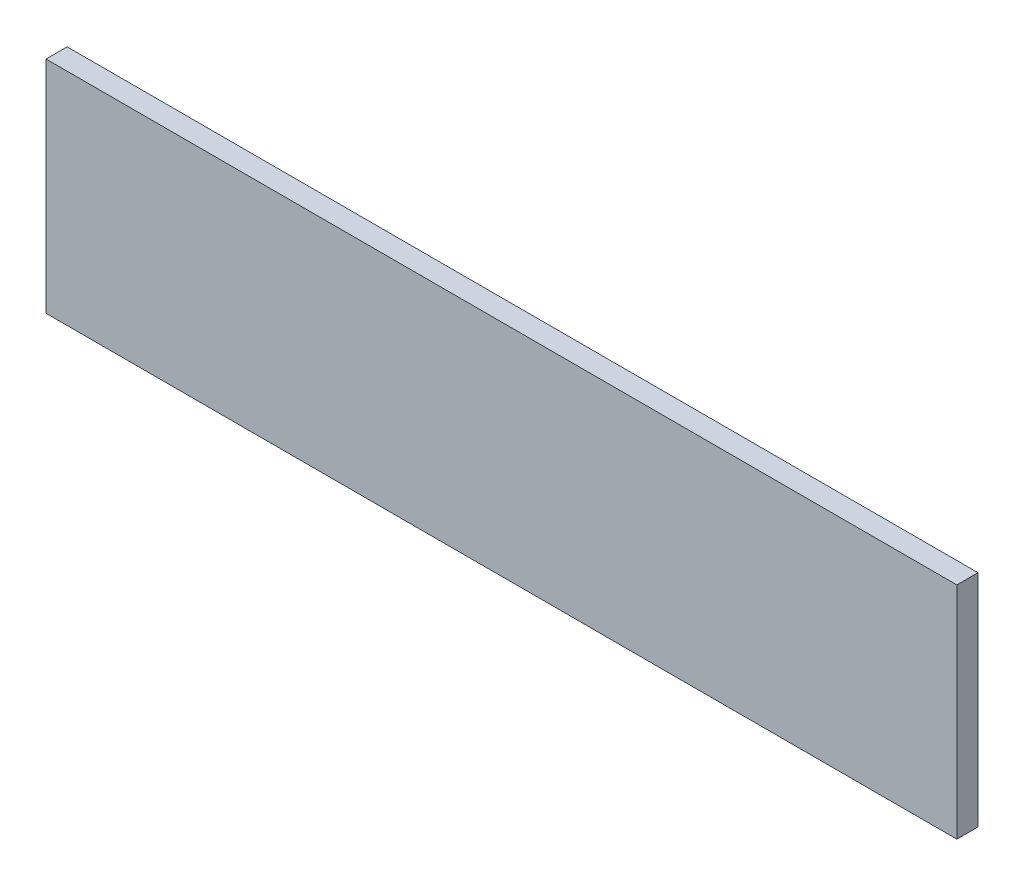
ISO-10303-21;
HEADER;
FILE_DESCRIPTION(('STEP AP214'),'2;1');
FILE_NAME('part.step','',(''),(''),'','','');
FILE_SCHEMA(('AUTOMOTIVE_DESIGN { 1 0 10303 214 1 1 1 1 }'));
ENDSEC;
DATA;
#1=APPLICATION_CONTEXT('core data for automotive mechanical design processes');
#2=APPLICATION_PROTOCOL_DEFINITION('international standard','automotive_design',2000,#1);
#3=PRODUCT_CONTEXT('',#1,'mechanical');
#4=PRODUCT('Part','Part','',(#3));
#5=PRODUCT_RELATED_PRODUCT_CATEGORY('part','',(#4));
#6=PRODUCT_DEFINITION_FORMATION('','',#4);
#7=PRODUCT_DEFINITION_CONTEXT('part definition',#1,'design');
#8=PRODUCT_DEFINITION('design','',#6,#7);
#9=PRODUCT_DEFINITION_SHAPE('','',#8);
#10=(LENGTH_UNIT() NAMED_UNIT(*) SI_UNIT(.MILLI.,.METRE.));
#11=(NAMED_UNIT(*) PLANE_ANGLE_UNIT() SI_UNIT($,.RADIAN.));
#12=(NAMED_UNIT(*) SI_UNIT($,.STERADIAN.) SOLID_ANGLE_UNIT());
#13=UNCERTAINTY_MEASURE_WITH_UNIT(LENGTH_MEASURE(1.E-05),#10,'distance_accuracy_value','');
#14=(GEOMETRIC_REPRESENTATION_CONTEXT(3) GLOBAL_UNCERTAINTY_ASSIGNED_CONTEXT((#13)) GLOBAL_UNIT_ASSIGNED_CONTEXT((#10,
#11,#12)) REPRESENTATION_CONTEXT('',''));
#15=CARTESIAN_POINT('',(0.,0.,0.));
#16=DIRECTION('',(0.,0.,1.));
#17=DIRECTION('',(1.,0.,0.));
#18=AXIS2_PLACEMENT_3D('',#15,#16,#17);
#19=CARTESIAN_POINT('',(0.,0.,19.));
#20=DIRECTION('',(1.,0.,0.));
#21=DIRECTION('',(0.,0.,-1.));
#22=AXIS2_PLACEMENT_3D('',#19,#20,#21);
#23=PLANE('',#22);
#24=DIRECTION('',(0.,-1.,0.));
#25=VECTOR('',#24,1.);
#26=CARTESIAN_POINT('',(0.,0.,0.));
#27=LINE('',#26,#25);
#28=CARTESIAN_POINT('',(0.,198.,0.));
#29=VERTEX_POINT('',#28);
#30=CARTESIAN_POINT('',(0.,0.,0.));
#31=VERTEX_POINT('',#30);
#32=EDGE_CURVE('E99',#29,#31,#27,.T.);
#33=ORIENTED_EDGE('',*,*,#32,.T.);
#34=DIRECTION('',(0.,0.,-1.));
#35=VECTOR('',#34,1.);
#36=CARTESIAN_POINT('',(0.,0.,19.));
#37=LINE('',#36,#35);
#38=CARTESIAN_POINT('',(0.,0.,19.));
#39=VERTEX_POINT('',#38);
#40=EDGE_CURVE('E11',#39,#31,#37,.T.);
#41=ORIENTED_EDGE('',*,*,#40,.F.);
#42=DIRECTION('',(0.,-1.,0.));
#43=VECTOR('',#42,1.);
#44=CARTESIAN_POINT('',(0.,0.,19.));
#45=LINE('',#44,#43);
#46=CARTESIAN_POINT('',(0.,198.,19.));
#47=VERTEX_POINT('',#46);
#48=EDGE_CURVE('E87',#47,#39,#45,.T.);
#49=ORIENTED_EDGE('',*,*,#48,.F.);
#50=DIRECTION('',(0.,0.,-1.));
#51=VECTOR('',#50,1.);
#52=CARTESIAN_POINT('',(0.,198.,19.));
#53=LINE('',#52,#51);
#54=EDGE_CURVE('E95',#47,#29,#53,.T.);
#55=ORIENTED_EDGE('',*,*,#54,.T.);
#56=EDGE_LOOP('',(#33,#41,#49,#55));
#57=FACE_BOUND('',#56,.T.);
#58=ADVANCED_FACE('F36',(#57),#23,.F.);
#59=CARTESIAN_POINT('',(0.,0.,19.));
#60=DIRECTION('',(0.,1.,0.));
#61=DIRECTION('',(0.,0.,1.));
#62=AXIS2_PLACEMENT_3D('',#59,#60,#61);
#63=PLANE('',#62);
#64=DIRECTION('',(1.,0.,0.));
#65=VECTOR('',#64,1.);
#66=CARTESIAN_POINT('',(0.,0.,0.));
#67=LINE('',#66,#65);
#68=CARTESIAN_POINT('',(819.,0.,0.));
#69=VERTEX_POINT('',#68);
#70=EDGE_CURVE('E91',#31,#69,#67,.T.);
#71=ORIENTED_EDGE('',*,*,#70,.T.);
#72=DIRECTION('',(0.,0.,-1.));
#73=VECTOR('',#72,1.);
#74=CARTESIAN_POINT('',(819.,0.,19.));
#75=LINE('',#74,#73);
#76=CARTESIAN_POINT('',(819.,0.,19.));
#77=VERTEX_POINT('',#76);
#78=EDGE_CURVE('E44',#77,#69,#75,.T.);
#79=ORIENTED_EDGE('',*,*,#78,.F.);
#80=DIRECTION('',(1.,0.,0.));
#81=VECTOR('',#80,1.);
#82=CARTESIAN_POINT('',(0.,0.,19.));
#83=LINE('',#82,#81);
#84=EDGE_CURVE('E82',#39,#77,#83,.T.);
#85=ORIENTED_EDGE('',*,*,#84,.F.);
#86=ORIENTED_EDGE('',*,*,#40,.T.);
#87=EDGE_LOOP('',(#71,#79,#85,#86));
#88=FACE_BOUND('',#87,.T.);
#89=ADVANCED_FACE('F90',(#88),#63,.F.);
#90=CARTESIAN_POINT('',(819.,0.,19.));
#91=DIRECTION('',(-1.,0.,0.));
#92=DIRECTION('',(0.,0.,1.));
#93=AXIS2_PLACEMENT_3D('',#90,#91,#92);
#94=PLANE('',#93);
#95=DIRECTION('',(0.,1.,0.));
#96=VECTOR('',#95,1.);
#97=CARTESIAN_POINT('',(819.,0.,0.));
#98=LINE('',#97,#96);
#99=CARTESIAN_POINT('',(819.,198.,0.));
#100=VERTEX_POINT('',#99);
#101=EDGE_CURVE('E69',#69,#100,#98,.T.);
#102=ORIENTED_EDGE('',*,*,#101,.T.);
#103=DIRECTION('',(0.,0.,-1.));
#104=VECTOR('',#103,1.);
#105=CARTESIAN_POINT('',(819.,198.,19.));
#106=LINE('',#105,#104);
#107=CARTESIAN_POINT('',(819.,198.,19.));
#108=VERTEX_POINT('',#107);
#109=EDGE_CURVE('E92',#108,#100,#106,.T.);
#110=ORIENTED_EDGE('',*,*,#109,.F.);
#111=DIRECTION('',(0.,1.,0.));
#112=VECTOR('',#111,1.);
#113=CARTESIAN_POINT('',(819.,0.,19.));
#114=LINE('',#113,#112);
#115=EDGE_CURVE('E85',#77,#108,#114,.T.);
#116=ORIENTED_EDGE('',*,*,#115,.F.);
#117=ORIENTED_EDGE('',*,*,#78,.T.);
#118=EDGE_LOOP('',(#102,#110,#116,#117));
#119=FACE_BOUND('',#118,.T.);
#120=ADVANCED_FACE('F93',(#119),#94,.F.);
#121=CARTESIAN_POINT('',(0.,198.,19.));
#122=DIRECTION('',(0.,-1.,0.));
#123=DIRECTION('',(0.,0.,-1.));
#124=AXIS2_PLACEMENT_3D('',#121,#122,#123);
#125=PLANE('',#124);
#126=DIRECTION('',(-1.,0.,0.));
#127=VECTOR('',#126,1.);
#128=CARTESIAN_POINT('',(0.,198.,0.));
#129=LINE('',#128,#127);
#130=EDGE_CURVE('E75',#100,#29,#129,.T.);
#131=ORIENTED_EDGE('',*,*,#130,.T.);
#132=ORIENTED_EDGE('',*,*,#54,.F.);
#133=DIRECTION('',(-1.,0.,0.));
#134=VECTOR('',#133,1.);
#135=CARTESIAN_POINT('',(0.,198.,19.));
#136=LINE('',#135,#134);
#137=EDGE_CURVE('E52',#108,#47,#136,.T.);
#138=ORIENTED_EDGE('',*,*,#137,.F.);
#139=ORIENTED_EDGE('',*,*,#109,.T.);
#140=EDGE_LOOP('',(#131,#132,#138,#139));
#141=FACE_BOUND('',#140,.T.);
#142=ADVANCED_FACE('F106',(#141),#125,.F.);
#143=CARTESIAN_POINT('',(0.,0.,19.));
#144=DIRECTION('',(0.,0.,-1.));
#145=DIRECTION('',(-1.,0.,0.));
#146=AXIS2_PLACEMENT_3D('',#143,#144,#145);
#147=PLANE('',#146);
#148=ORIENTED_EDGE('',*,*,#48,.T.);
#149=ORIENTED_EDGE('',*,*,#84,.T.);
#150=ORIENTED_EDGE('',*,*,#115,.T.);
#151=ORIENTED_EDGE('',*,*,#137,.T.);
#152=EDGE_LOOP('',(#148,#149,#150,#151));
#153=FACE_BOUND('',#152,.T.);
#154=ADVANCED_FACE('F83',(#153),#147,.F.);
#155=CARTESIAN_POINT('',(0.,0.,0.));
#156=DIRECTION('',(0.,0.,-1.));
#157=DIRECTION('',(-1.,0.,0.));
#158=AXIS2_PLACEMENT_3D('',#155,#156,#157);
#159=PLANE('',#158);
#160=ORIENTED_EDGE('',*,*,#32,.F.);
#161=ORIENTED_EDGE('',*,*,#130,.F.);
#162=ORIENTED_EDGE('',*,*,#101,.F.);
#163=ORIENTED_EDGE('',*,*,#70,.F.);
#164=EDGE_LOOP('',(#160,#161,#162,#163));
#165=FACE_BOUND('',#164,.T.);
#166=ADVANCED_FACE('F109',(#165),#159,.T.);
#167=CLOSED_SHELL('',(#58,#89,#120,#142,#154,#166));
#168=MANIFOLD_SOLID_BREP('B2',#167);
#169=ADVANCED_BREP_SHAPE_REPRESENTATION('',(#18,#168),#14);
#170=SHAPE_DEFINITION_REPRESENTATION(#9,#169);
ENDSEC;
END-ISO-10303-21;
